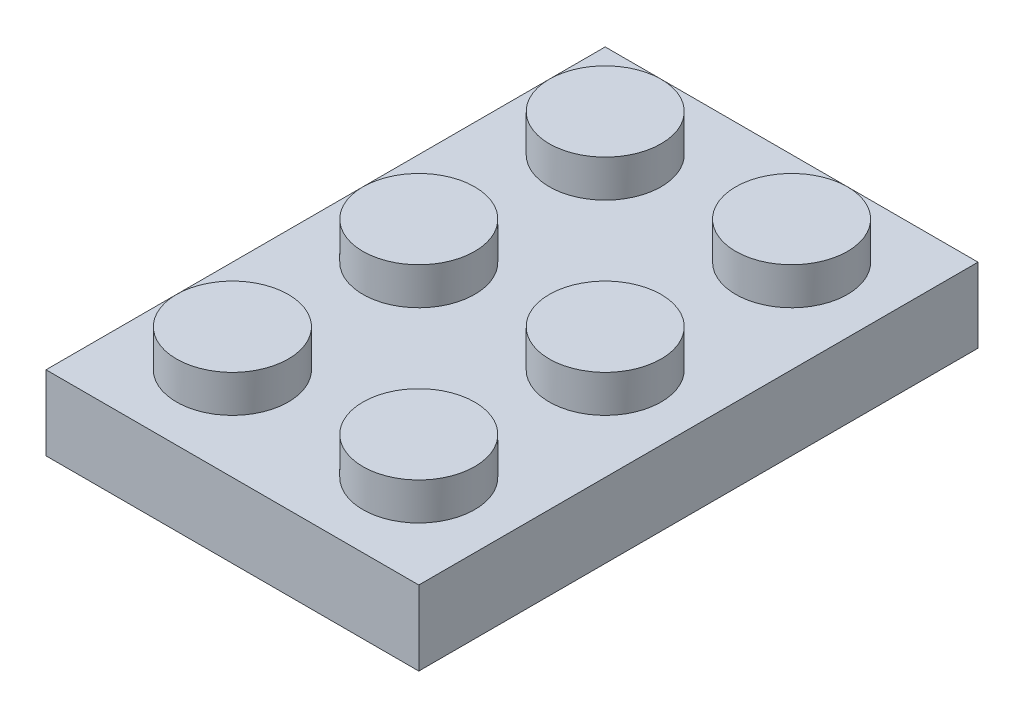
ISO-10303-21;
HEADER;
FILE_DESCRIPTION(('STEP AP214'),'2;1');
FILE_NAME('part.step','',(''),(''),'','','');
FILE_SCHEMA(('AUTOMOTIVE_DESIGN { 1 0 10303 214 1 1 1 1 }'));
ENDSEC;
DATA;
#1=APPLICATION_CONTEXT('core data for automotive mechanical design processes');
#2=APPLICATION_PROTOCOL_DEFINITION('international standard','automotive_design',2000,#1);
#3=PRODUCT_CONTEXT('',#1,'mechanical');
#4=PRODUCT('Part','Part','',(#3));
#5=PRODUCT_RELATED_PRODUCT_CATEGORY('part','',(#4));
#6=PRODUCT_DEFINITION_FORMATION('','',#4);
#7=PRODUCT_DEFINITION_CONTEXT('part definition',#1,'design');
#8=PRODUCT_DEFINITION('design','',#6,#7);
#9=PRODUCT_DEFINITION_SHAPE('','',#8);
#10=(LENGTH_UNIT() NAMED_UNIT(*) SI_UNIT(.MILLI.,.METRE.));
#11=(NAMED_UNIT(*) PLANE_ANGLE_UNIT() SI_UNIT($,.RADIAN.));
#12=(NAMED_UNIT(*) SI_UNIT($,.STERADIAN.) SOLID_ANGLE_UNIT());
#13=UNCERTAINTY_MEASURE_WITH_UNIT(LENGTH_MEASURE(1.E-05),#10,'distance_accuracy_value','');
#14=(GEOMETRIC_REPRESENTATION_CONTEXT(3) GLOBAL_UNCERTAINTY_ASSIGNED_CONTEXT((#13)) GLOBAL_UNIT_ASSIGNED_CONTEXT((#10,
#11,#12)) REPRESENTATION_CONTEXT('',''));
#15=CARTESIAN_POINT('',(0.,0.,0.));
#16=DIRECTION('',(0.,0.,1.));
#17=DIRECTION('',(1.,0.,0.));
#18=AXIS2_PLACEMENT_3D('',#15,#16,#17);
#19=CARTESIAN_POINT('',(0.,0.,0.));
#20=DIRECTION('',(0.,-1.,0.));
#21=DIRECTION('',(0.,0.,-1.));
#22=AXIS2_PLACEMENT_3D('',#19,#20,#21);
#23=PLANE('',#22);
#24=DIRECTION('',(0.,0.,1.));
#25=VECTOR('',#24,1.);
#26=CARTESIAN_POINT('',(0.,0.,0.));
#27=LINE('',#26,#25);
#28=CARTESIAN_POINT('',(0.,0.,-24.));
#29=VERTEX_POINT('',#28);
#30=CARTESIAN_POINT('',(0.,0.,0.));
#31=VERTEX_POINT('',#30);
#32=EDGE_CURVE('E184',#29,#31,#27,.T.);
#33=ORIENTED_EDGE('',*,*,#32,.F.);
#34=DIRECTION('',(-1.,0.,0.));
#35=VECTOR('',#34,1.);
#36=CARTESIAN_POINT('',(0.,0.,-24.));
#37=LINE('',#36,#35);
#38=CARTESIAN_POINT('',(16.,0.,-24.));
#39=VERTEX_POINT('',#38);
#40=EDGE_CURVE('E82',#39,#29,#37,.T.);
#41=ORIENTED_EDGE('',*,*,#40,.F.);
#42=DIRECTION('',(0.,0.,-1.));
#43=VECTOR('',#42,1.);
#44=CARTESIAN_POINT('',(16.,0.,0.));
#45=LINE('',#44,#43);
#46=CARTESIAN_POINT('',(16.,0.,0.));
#47=VERTEX_POINT('',#46);
#48=EDGE_CURVE('E196',#47,#39,#45,.T.);
#49=ORIENTED_EDGE('',*,*,#48,.F.);
#50=DIRECTION('',(1.,0.,0.));
#51=VECTOR('',#50,1.);
#52=CARTESIAN_POINT('',(0.,0.,0.));
#53=LINE('',#52,#51);
#54=EDGE_CURVE('E194',#31,#47,#53,.T.);
#55=ORIENTED_EDGE('',*,*,#54,.F.);
#56=EDGE_LOOP('',(#33,#41,#49,#55));
#57=FACE_BOUND('',#56,.T.);
#58=DIRECTION('',(-1.,0.,0.));
#59=VECTOR('',#58,1.);
#60=CARTESIAN_POINT('',(0.,0.,-22.4));
#61=LINE('',#60,#59);
#62=CARTESIAN_POINT('',(14.4,0.,-22.4));
#63=VERTEX_POINT('',#62);
#64=CARTESIAN_POINT('',(1.6,0.,-22.4));
#65=VERTEX_POINT('',#64);
#66=EDGE_CURVE('E172',#63,#65,#61,.T.);
#67=ORIENTED_EDGE('',*,*,#66,.T.);
#68=DIRECTION('',(0.,0.,1.));
#69=VECTOR('',#68,1.);
#70=CARTESIAN_POINT('',(1.6,0.,0.));
#71=LINE('',#70,#69);
#72=CARTESIAN_POINT('',(1.6,0.,-1.6));
#73=VERTEX_POINT('',#72);
#74=EDGE_CURVE('E165',#65,#73,#71,.T.);
#75=ORIENTED_EDGE('',*,*,#74,.T.);
#76=DIRECTION('',(1.,0.,0.));
#77=VECTOR('',#76,1.);
#78=CARTESIAN_POINT('',(0.,0.,-1.6));
#79=LINE('',#78,#77);
#80=CARTESIAN_POINT('',(14.4,0.,-1.6));
#81=VERTEX_POINT('',#80);
#82=EDGE_CURVE('E171',#73,#81,#79,.T.);
#83=ORIENTED_EDGE('',*,*,#82,.T.);
#84=DIRECTION('',(0.,0.,-1.));
#85=VECTOR('',#84,1.);
#86=CARTESIAN_POINT('',(14.4,0.,0.));
#87=LINE('',#86,#85);
#88=EDGE_CURVE('E52',#81,#63,#87,.T.);
#89=ORIENTED_EDGE('',*,*,#88,.T.);
#90=EDGE_LOOP('',(#67,#75,#83,#89));
#91=FACE_BOUND('',#90,.T.);
#92=ADVANCED_FACE('F37',(#57,#91),#23,.T.);
#93=CARTESIAN_POINT('',(4.,4.8,-20.));
#94=DIRECTION('',(0.,1.,0.));
#95=DIRECTION('',(0.,0.,1.));
#96=AXIS2_PLACEMENT_3D('',#93,#94,#95);
#97=PLANE('',#96);
#98=CARTESIAN_POINT('',(4.,4.8,-20.));
#99=DIRECTION('',(0.,1.,0.));
#100=DIRECTION('',(0.,0.,1.));
#101=AXIS2_PLACEMENT_3D('',#98,#99,#100);
#102=CIRCLE('',#101,2.4);
#103=CARTESIAN_POINT('',(4.,4.8,-17.6));
#104=VERTEX_POINT('',#103);
#105=EDGE_CURVE('E11',#104,#104,#102,.T.);
#106=ORIENTED_EDGE('',*,*,#105,.T.);
#107=EDGE_LOOP('',(#106));
#108=FACE_BOUND('',#107,.T.);
#109=ADVANCED_FACE('F39',(#108),#97,.T.);
#110=CARTESIAN_POINT('',(4.,4.8,-20.));
#111=DIRECTION('',(0.,-1.,0.));
#112=DIRECTION('',(0.,0.,-1.));
#113=AXIS2_PLACEMENT_3D('',#110,#111,#112);
#114=CYLINDRICAL_SURFACE('',#113,2.4);
#115=ORIENTED_EDGE('',*,*,#105,.F.);
#116=EDGE_LOOP('',(#115));
#117=FACE_BOUND('',#116,.T.);
#118=CARTESIAN_POINT('',(4.,3.2,-20.));
#119=DIRECTION('',(0.,-1.,0.));
#120=DIRECTION('',(0.,0.,-1.));
#121=AXIS2_PLACEMENT_3D('',#118,#119,#120);
#122=CIRCLE('',#121,2.4);
#123=CARTESIAN_POINT('',(4.,3.2,-22.4));
#124=VERTEX_POINT('',#123);
#125=EDGE_CURVE('E45',#124,#124,#122,.F.);
#126=ORIENTED_EDGE('',*,*,#125,.T.);
#127=EDGE_LOOP('',(#126));
#128=FACE_BOUND('',#127,.T.);
#129=ADVANCED_FACE('F233',(#117,#128),#114,.T.);
#130=CARTESIAN_POINT('',(12.,4.8,-20.));
#131=DIRECTION('',(0.,1.,0.));
#132=DIRECTION('',(0.,0.,1.));
#133=AXIS2_PLACEMENT_3D('',#130,#131,#132);
#134=PLANE('',#133);
#135=CARTESIAN_POINT('',(12.,4.8,-20.));
#136=DIRECTION('',(0.,1.,0.));
#137=DIRECTION('',(0.,0.,1.));
#138=AXIS2_PLACEMENT_3D('',#135,#136,#137);
#139=CIRCLE('',#138,2.4);
#140=CARTESIAN_POINT('',(12.,4.8,-17.6));
#141=VERTEX_POINT('',#140);
#142=EDGE_CURVE('E228',#141,#141,#139,.T.);
#143=ORIENTED_EDGE('',*,*,#142,.T.);
#144=EDGE_LOOP('',(#143));
#145=FACE_BOUND('',#144,.T.);
#146=ADVANCED_FACE('F291',(#145),#134,.T.);
#147=CARTESIAN_POINT('',(12.,4.8,-20.));
#148=DIRECTION('',(0.,-1.,0.));
#149=DIRECTION('',(0.,0.,-1.));
#150=AXIS2_PLACEMENT_3D('',#147,#148,#149);
#151=CYLINDRICAL_SURFACE('',#150,2.4);
#152=ORIENTED_EDGE('',*,*,#142,.F.);
#153=EDGE_LOOP('',(#152));
#154=FACE_BOUND('',#153,.T.);
#155=CARTESIAN_POINT('',(12.,3.2,-20.));
#156=DIRECTION('',(0.,-1.,0.));
#157=DIRECTION('',(0.,0.,-1.));
#158=AXIS2_PLACEMENT_3D('',#155,#156,#157);
#159=CIRCLE('',#158,2.4);
#160=CARTESIAN_POINT('',(12.,3.2,-22.4));
#161=VERTEX_POINT('',#160);
#162=EDGE_CURVE('E225',#161,#161,#159,.F.);
#163=ORIENTED_EDGE('',*,*,#162,.T.);
#164=EDGE_LOOP('',(#163));
#165=FACE_BOUND('',#164,.T.);
#166=ADVANCED_FACE('F287',(#154,#165),#151,.T.);
#167=CARTESIAN_POINT('',(4.,4.8,-12.));
#168=DIRECTION('',(0.,1.,0.));
#169=DIRECTION('',(0.,0.,1.));
#170=AXIS2_PLACEMENT_3D('',#167,#168,#169);
#171=PLANE('',#170);
#172=CARTESIAN_POINT('',(4.,4.8,-12.));
#173=DIRECTION('',(0.,1.,0.));
#174=DIRECTION('',(0.,0.,1.));
#175=AXIS2_PLACEMENT_3D('',#172,#173,#174);
#176=CIRCLE('',#175,2.4);
#177=CARTESIAN_POINT('',(4.,4.8,-9.6));
#178=VERTEX_POINT('',#177);
#179=EDGE_CURVE('E222',#178,#178,#176,.T.);
#180=ORIENTED_EDGE('',*,*,#179,.T.);
#181=EDGE_LOOP('',(#180));
#182=FACE_BOUND('',#181,.T.);
#183=ADVANCED_FACE('F283',(#182),#171,.T.);
#184=CARTESIAN_POINT('',(4.,4.8,-12.));
#185=DIRECTION('',(0.,-1.,0.));
#186=DIRECTION('',(0.,0.,-1.));
#187=AXIS2_PLACEMENT_3D('',#184,#185,#186);
#188=CYLINDRICAL_SURFACE('',#187,2.4);
#189=ORIENTED_EDGE('',*,*,#179,.F.);
#190=EDGE_LOOP('',(#189));
#191=FACE_BOUND('',#190,.T.);
#192=CARTESIAN_POINT('',(4.,3.2,-12.));
#193=DIRECTION('',(0.,-1.,0.));
#194=DIRECTION('',(0.,0.,-1.));
#195=AXIS2_PLACEMENT_3D('',#192,#193,#194);
#196=CIRCLE('',#195,2.4);
#197=CARTESIAN_POINT('',(4.,3.2,-14.4));
#198=VERTEX_POINT('',#197);
#199=EDGE_CURVE('E219',#198,#198,#196,.F.);
#200=ORIENTED_EDGE('',*,*,#199,.T.);
#201=EDGE_LOOP('',(#200));
#202=FACE_BOUND('',#201,.T.);
#203=ADVANCED_FACE('F279',(#191,#202),#188,.T.);
#204=CARTESIAN_POINT('',(12.,4.8,-12.));
#205=DIRECTION('',(0.,1.,0.));
#206=DIRECTION('',(0.,0.,1.));
#207=AXIS2_PLACEMENT_3D('',#204,#205,#206);
#208=PLANE('',#207);
#209=CARTESIAN_POINT('',(12.,4.8,-12.));
#210=DIRECTION('',(0.,1.,0.));
#211=DIRECTION('',(0.,0.,1.));
#212=AXIS2_PLACEMENT_3D('',#209,#210,#211);
#213=CIRCLE('',#212,2.4);
#214=CARTESIAN_POINT('',(12.,4.8,-9.6));
#215=VERTEX_POINT('',#214);
#216=EDGE_CURVE('E216',#215,#215,#213,.T.);
#217=ORIENTED_EDGE('',*,*,#216,.T.);
#218=EDGE_LOOP('',(#217));
#219=FACE_BOUND('',#218,.T.);
#220=ADVANCED_FACE('F275',(#219),#208,.T.);
#221=CARTESIAN_POINT('',(12.,4.8,-12.));
#222=DIRECTION('',(0.,-1.,0.));
#223=DIRECTION('',(0.,0.,-1.));
#224=AXIS2_PLACEMENT_3D('',#221,#222,#223);
#225=CYLINDRICAL_SURFACE('',#224,2.4);
#226=ORIENTED_EDGE('',*,*,#216,.F.);
#227=EDGE_LOOP('',(#226));
#228=FACE_BOUND('',#227,.T.);
#229=CARTESIAN_POINT('',(12.,3.2,-12.));
#230=DIRECTION('',(0.,-1.,0.));
#231=DIRECTION('',(0.,0.,-1.));
#232=AXIS2_PLACEMENT_3D('',#229,#230,#231);
#233=CIRCLE('',#232,2.4);
#234=CARTESIAN_POINT('',(12.,3.2,-14.4));
#235=VERTEX_POINT('',#234);
#236=EDGE_CURVE('E213',#235,#235,#233,.F.);
#237=ORIENTED_EDGE('',*,*,#236,.T.);
#238=EDGE_LOOP('',(#237));
#239=FACE_BOUND('',#238,.T.);
#240=ADVANCED_FACE('F271',(#228,#239),#225,.T.);
#241=CARTESIAN_POINT('',(0.,3.2,0.));
#242=DIRECTION('',(1.,0.,0.));
#243=DIRECTION('',(0.,0.,-1.));
#244=AXIS2_PLACEMENT_3D('',#241,#242,#243);
#245=PLANE('',#244);
#246=ORIENTED_EDGE('',*,*,#32,.T.);
#247=DIRECTION('',(0.,-1.,0.));
#248=VECTOR('',#247,1.);
#249=CARTESIAN_POINT('',(0.,3.2,0.));
#250=LINE('',#249,#248);
#251=CARTESIAN_POINT('',(0.,3.2,0.));
#252=VERTEX_POINT('',#251);
#253=EDGE_CURVE('E205',#252,#31,#250,.T.);
#254=ORIENTED_EDGE('',*,*,#253,.F.);
#255=DIRECTION('',(0.,0.,1.));
#256=VECTOR('',#255,1.);
#257=CARTESIAN_POINT('',(0.,3.2,0.));
#258=LINE('',#257,#256);
#259=CARTESIAN_POINT('',(0.,3.2,-24.));
#260=VERTEX_POINT('',#259);
#261=EDGE_CURVE('E185',#260,#252,#258,.T.);
#262=ORIENTED_EDGE('',*,*,#261,.F.);
#263=DIRECTION('',(0.,-1.,0.));
#264=VECTOR('',#263,1.);
#265=CARTESIAN_POINT('',(0.,3.2,-24.));
#266=LINE('',#265,#264);
#267=EDGE_CURVE('E191',#260,#29,#266,.T.);
#268=ORIENTED_EDGE('',*,*,#267,.T.);
#269=EDGE_LOOP('',(#246,#254,#262,#268));
#270=FACE_BOUND('',#269,.T.);
#271=ADVANCED_FACE('F268',(#270),#245,.F.);
#272=CARTESIAN_POINT('',(0.,3.2,0.));
#273=DIRECTION('',(0.,0.,-1.));
#274=DIRECTION('',(-1.,0.,0.));
#275=AXIS2_PLACEMENT_3D('',#272,#273,#274);
#276=PLANE('',#275);
#277=ORIENTED_EDGE('',*,*,#54,.T.);
#278=DIRECTION('',(0.,-1.,0.));
#279=VECTOR('',#278,1.);
#280=CARTESIAN_POINT('',(16.,3.2,0.));
#281=LINE('',#280,#279);
#282=CARTESIAN_POINT('',(16.,3.2,0.));
#283=VERTEX_POINT('',#282);
#284=EDGE_CURVE('E202',#283,#47,#281,.T.);
#285=ORIENTED_EDGE('',*,*,#284,.F.);
#286=DIRECTION('',(1.,0.,0.));
#287=VECTOR('',#286,1.);
#288=CARTESIAN_POINT('',(0.,3.2,0.));
#289=LINE('',#288,#287);
#290=EDGE_CURVE('E90',#252,#283,#289,.T.);
#291=ORIENTED_EDGE('',*,*,#290,.F.);
#292=ORIENTED_EDGE('',*,*,#253,.T.);
#293=EDGE_LOOP('',(#277,#285,#291,#292));
#294=FACE_BOUND('',#293,.T.);
#295=ADVANCED_FACE('F264',(#294),#276,.F.);
#296=CARTESIAN_POINT('',(16.,3.2,0.));
#297=DIRECTION('',(-1.,0.,0.));
#298=DIRECTION('',(0.,0.,1.));
#299=AXIS2_PLACEMENT_3D('',#296,#297,#298);
#300=PLANE('',#299);
#301=ORIENTED_EDGE('',*,*,#48,.T.);
#302=DIRECTION('',(0.,-1.,0.));
#303=VECTOR('',#302,1.);
#304=CARTESIAN_POINT('',(16.,3.2,-24.));
#305=LINE('',#304,#303);
#306=CARTESIAN_POINT('',(16.,3.2,-24.));
#307=VERTEX_POINT('',#306);
#308=EDGE_CURVE('E200',#307,#39,#305,.T.);
#309=ORIENTED_EDGE('',*,*,#308,.F.);
#310=DIRECTION('',(0.,0.,-1.));
#311=VECTOR('',#310,1.);
#312=CARTESIAN_POINT('',(16.,3.2,0.));
#313=LINE('',#312,#311);
#314=EDGE_CURVE('E188',#283,#307,#313,.T.);
#315=ORIENTED_EDGE('',*,*,#314,.F.);
#316=ORIENTED_EDGE('',*,*,#284,.T.);
#317=EDGE_LOOP('',(#301,#309,#315,#316));
#318=FACE_BOUND('',#317,.T.);
#319=ADVANCED_FACE('F248',(#318),#300,.F.);
#320=CARTESIAN_POINT('',(0.,3.2,-24.));
#321=DIRECTION('',(0.,0.,1.));
#322=DIRECTION('',(1.,0.,0.));
#323=AXIS2_PLACEMENT_3D('',#320,#321,#322);
#324=PLANE('',#323);
#325=ORIENTED_EDGE('',*,*,#40,.T.);
#326=ORIENTED_EDGE('',*,*,#267,.F.);
#327=DIRECTION('',(-1.,0.,0.));
#328=VECTOR('',#327,1.);
#329=CARTESIAN_POINT('',(0.,3.2,-24.));
#330=LINE('',#329,#328);
#331=EDGE_CURVE('E61',#307,#260,#330,.T.);
#332=ORIENTED_EDGE('',*,*,#331,.F.);
#333=ORIENTED_EDGE('',*,*,#308,.T.);
#334=EDGE_LOOP('',(#325,#326,#332,#333));
#335=FACE_BOUND('',#334,.T.);
#336=ADVANCED_FACE('F238',(#335),#324,.F.);
#337=CARTESIAN_POINT('',(0.,3.2,0.));
#338=DIRECTION('',(0.,-1.,0.));
#339=DIRECTION('',(0.,0.,-1.));
#340=AXIS2_PLACEMENT_3D('',#337,#338,#339);
#341=PLANE('',#340);
#342=CARTESIAN_POINT('',(4.,3.2,-4.));
#343=DIRECTION('',(0.,-1.,0.));
#344=DIRECTION('',(0.,0.,-1.));
#345=AXIS2_PLACEMENT_3D('',#342,#343,#344);
#346=CIRCLE('',#345,2.4);
#347=CARTESIAN_POINT('',(4.,3.2,-6.4));
#348=VERTEX_POINT('',#347);
#349=EDGE_CURVE('E210',#348,#348,#346,.F.);
#350=ORIENTED_EDGE('',*,*,#349,.F.);
#351=EDGE_LOOP('',(#350));
#352=FACE_BOUND('',#351,.T.);
#353=CARTESIAN_POINT('',(12.,3.2,-4.));
#354=DIRECTION('',(0.,-1.,0.));
#355=DIRECTION('',(0.,0.,-1.));
#356=AXIS2_PLACEMENT_3D('',#353,#354,#355);
#357=CIRCLE('',#356,2.4);
#358=CARTESIAN_POINT('',(12.,3.2,-6.4));
#359=VERTEX_POINT('',#358);
#360=EDGE_CURVE('E207',#359,#359,#357,.F.);
#361=ORIENTED_EDGE('',*,*,#360,.F.);
#362=EDGE_LOOP('',(#361));
#363=FACE_BOUND('',#362,.T.);
#364=ORIENTED_EDGE('',*,*,#261,.T.);
#365=ORIENTED_EDGE('',*,*,#290,.T.);
#366=ORIENTED_EDGE('',*,*,#314,.T.);
#367=ORIENTED_EDGE('',*,*,#331,.T.);
#368=EDGE_LOOP('',(#364,#365,#366,#367));
#369=FACE_BOUND('',#368,.T.);
#370=ORIENTED_EDGE('',*,*,#236,.F.);
#371=EDGE_LOOP('',(#370));
#372=FACE_BOUND('',#371,.T.);
#373=ORIENTED_EDGE('',*,*,#199,.F.);
#374=EDGE_LOOP('',(#373));
#375=FACE_BOUND('',#374,.T.);
#376=ORIENTED_EDGE('',*,*,#162,.F.);
#377=EDGE_LOOP('',(#376));
#378=FACE_BOUND('',#377,.T.);
#379=ORIENTED_EDGE('',*,*,#125,.F.);
#380=EDGE_LOOP('',(#379));
#381=FACE_BOUND('',#380,.T.);
#382=ADVANCED_FACE('F235',(#352,#363,#369,#372,#375,#378,#381),#341,.F.);
#383=CARTESIAN_POINT('',(12.,4.8,-4.));
#384=DIRECTION('',(0.,-1.,0.));
#385=DIRECTION('',(0.,0.,-1.));
#386=AXIS2_PLACEMENT_3D('',#383,#384,#385);
#387=CYLINDRICAL_SURFACE('',#386,2.4);
#388=CARTESIAN_POINT('',(12.,4.8,-4.));
#389=DIRECTION('',(0.,1.,0.));
#390=DIRECTION('',(0.,0.,1.));
#391=AXIS2_PLACEMENT_3D('',#388,#389,#390);
#392=CIRCLE('',#391,2.4);
#393=CARTESIAN_POINT('',(12.,4.8,-1.6));
#394=VERTEX_POINT('',#393);
#395=EDGE_CURVE('E180',#394,#394,#392,.T.);
#396=ORIENTED_EDGE('',*,*,#395,.F.);
#397=EDGE_LOOP('',(#396));
#398=FACE_BOUND('',#397,.T.);
#399=ORIENTED_EDGE('',*,*,#360,.T.);
#400=EDGE_LOOP('',(#399));
#401=FACE_BOUND('',#400,.T.);
#402=ADVANCED_FACE('F237',(#398,#401),#387,.T.);
#403=CARTESIAN_POINT('',(12.,4.8,-4.));
#404=DIRECTION('',(0.,1.,0.));
#405=DIRECTION('',(0.,0.,1.));
#406=AXIS2_PLACEMENT_3D('',#403,#404,#405);
#407=PLANE('',#406);
#408=ORIENTED_EDGE('',*,*,#395,.T.);
#409=EDGE_LOOP('',(#408));
#410=FACE_BOUND('',#409,.T.);
#411=ADVANCED_FACE('F245',(#410),#407,.T.);
#412=CARTESIAN_POINT('',(4.,4.8,-4.));
#413=DIRECTION('',(0.,-1.,0.));
#414=DIRECTION('',(0.,0.,-1.));
#415=AXIS2_PLACEMENT_3D('',#412,#413,#414);
#416=CYLINDRICAL_SURFACE('',#415,2.4);
#417=CARTESIAN_POINT('',(4.,4.8,-4.));
#418=DIRECTION('',(0.,1.,0.));
#419=DIRECTION('',(0.,0.,1.));
#420=AXIS2_PLACEMENT_3D('',#417,#418,#419);
#421=CIRCLE('',#420,2.4);
#422=CARTESIAN_POINT('',(4.,4.8,-1.6));
#423=VERTEX_POINT('',#422);
#424=EDGE_CURVE('E177',#423,#423,#421,.T.);
#425=ORIENTED_EDGE('',*,*,#424,.F.);
#426=EDGE_LOOP('',(#425));
#427=FACE_BOUND('',#426,.T.);
#428=ORIENTED_EDGE('',*,*,#349,.T.);
#429=EDGE_LOOP('',(#428));
#430=FACE_BOUND('',#429,.T.);
#431=ADVANCED_FACE('F357',(#427,#430),#416,.T.);
#432=CARTESIAN_POINT('',(4.,4.8,-4.));
#433=DIRECTION('',(0.,1.,0.));
#434=DIRECTION('',(0.,0.,1.));
#435=AXIS2_PLACEMENT_3D('',#432,#433,#434);
#436=PLANE('',#435);
#437=ORIENTED_EDGE('',*,*,#424,.T.);
#438=EDGE_LOOP('',(#437));
#439=FACE_BOUND('',#438,.T.);
#440=ADVANCED_FACE('F387',(#439),#436,.T.);
#441=CARTESIAN_POINT('',(4.,3.2,-20.));
#442=DIRECTION('',(0.,1.,0.));
#443=DIRECTION('',(0.,0.,1.));
#444=AXIS2_PLACEMENT_3D('',#441,#442,#443);
#445=PLANE('',#444);
#446=CARTESIAN_POINT('',(4.,3.2,-20.));
#447=DIRECTION('',(0.,1.,0.));
#448=DIRECTION('',(0.,0.,1.));
#449=AXIS2_PLACEMENT_3D('',#446,#447,#448);
#450=CIRCLE('',#449,0.799999999999999);
#451=CARTESIAN_POINT('',(4.,3.2,-19.2));
#452=VERTEX_POINT('',#451);
#453=EDGE_CURVE('E181',#452,#452,#450,.T.);
#454=ORIENTED_EDGE('',*,*,#453,.F.);
#455=EDGE_LOOP('',(#454));
#456=FACE_BOUND('',#455,.T.);
#457=ADVANCED_FACE('F396',(#456),#445,.F.);
#458=CARTESIAN_POINT('',(4.,4.8,-20.));
#459=DIRECTION('',(0.,-1.,0.));
#460=DIRECTION('',(0.,0.,-1.));
#461=AXIS2_PLACEMENT_3D('',#458,#459,#460);
#462=CYLINDRICAL_SURFACE('',#461,0.799999999999999);
#463=ORIENTED_EDGE('',*,*,#453,.T.);
#464=EDGE_LOOP('',(#463));
#465=FACE_BOUND('',#464,.T.);
#466=CARTESIAN_POINT('',(4.,1.6,-20.));
#467=DIRECTION('',(0.,-1.,0.));
#468=DIRECTION('',(0.,0.,-1.));
#469=AXIS2_PLACEMENT_3D('',#466,#467,#468);
#470=CIRCLE('',#469,0.799999999999999);
#471=CARTESIAN_POINT('',(4.,1.6,-20.8));
#472=VERTEX_POINT('',#471);
#473=EDGE_CURVE('E153',#472,#472,#470,.F.);
#474=ORIENTED_EDGE('',*,*,#473,.F.);
#475=EDGE_LOOP('',(#474));
#476=FACE_BOUND('',#475,.T.);
#477=ADVANCED_FACE('F409',(#465,#476),#462,.F.);
#478=CARTESIAN_POINT('',(12.,3.2,-20.));
#479=DIRECTION('',(0.,1.,0.));
#480=DIRECTION('',(0.,0.,1.));
#481=AXIS2_PLACEMENT_3D('',#478,#479,#480);
#482=PLANE('',#481);
#483=CARTESIAN_POINT('',(12.,3.2,-20.));
#484=DIRECTION('',(0.,1.,0.));
#485=DIRECTION('',(0.,0.,1.));
#486=AXIS2_PLACEMENT_3D('',#483,#484,#485);
#487=CIRCLE('',#486,0.799999999999999);
#488=CARTESIAN_POINT('',(12.,3.2,-19.2));
#489=VERTEX_POINT('',#488);
#490=EDGE_CURVE('E150',#489,#489,#487,.T.);
#491=ORIENTED_EDGE('',*,*,#490,.F.);
#492=EDGE_LOOP('',(#491));
#493=FACE_BOUND('',#492,.T.);
#494=ADVANCED_FACE('F418',(#493),#482,.F.);
#495=CARTESIAN_POINT('',(12.,4.8,-20.));
#496=DIRECTION('',(0.,-1.,0.));
#497=DIRECTION('',(0.,0.,-1.));
#498=AXIS2_PLACEMENT_3D('',#495,#496,#497);
#499=CYLINDRICAL_SURFACE('',#498,0.799999999999999);
#500=ORIENTED_EDGE('',*,*,#490,.T.);
#501=EDGE_LOOP('',(#500));
#502=FACE_BOUND('',#501,.T.);
#503=CARTESIAN_POINT('',(12.,1.6,-20.));
#504=DIRECTION('',(0.,-1.,0.));
#505=DIRECTION('',(0.,0.,-1.));
#506=AXIS2_PLACEMENT_3D('',#503,#504,#505);
#507=CIRCLE('',#506,0.799999999999999);
#508=CARTESIAN_POINT('',(12.,1.6,-20.8));
#509=VERTEX_POINT('',#508);
#510=EDGE_CURVE('E147',#509,#509,#507,.F.);
#511=ORIENTED_EDGE('',*,*,#510,.F.);
#512=EDGE_LOOP('',(#511));
#513=FACE_BOUND('',#512,.T.);
#514=ADVANCED_FACE('F427',(#502,#513),#499,.F.);
#515=CARTESIAN_POINT('',(4.,3.2,-12.));
#516=DIRECTION('',(0.,1.,0.));
#517=DIRECTION('',(0.,0.,1.));
#518=AXIS2_PLACEMENT_3D('',#515,#516,#517);
#519=PLANE('',#518);
#520=CARTESIAN_POINT('',(4.,3.2,-12.));
#521=DIRECTION('',(0.,1.,0.));
#522=DIRECTION('',(0.,0.,1.));
#523=AXIS2_PLACEMENT_3D('',#520,#521,#522);
#524=CIRCLE('',#523,0.799999999999999);
#525=CARTESIAN_POINT('',(4.,3.2,-11.2));
#526=VERTEX_POINT('',#525);
#527=EDGE_CURVE('E146',#526,#526,#524,.T.);
#528=ORIENTED_EDGE('',*,*,#527,.F.);
#529=EDGE_LOOP('',(#528));
#530=FACE_BOUND('',#529,.T.);
#531=ADVANCED_FACE('F436',(#530),#519,.F.);
#532=CARTESIAN_POINT('',(4.,4.8,-12.));
#533=DIRECTION('',(0.,-1.,0.));
#534=DIRECTION('',(0.,0.,-1.));
#535=AXIS2_PLACEMENT_3D('',#532,#533,#534);
#536=CYLINDRICAL_SURFACE('',#535,0.799999999999999);
#537=ORIENTED_EDGE('',*,*,#527,.T.);
#538=EDGE_LOOP('',(#537));
#539=FACE_BOUND('',#538,.T.);
#540=CARTESIAN_POINT('',(4.,1.6,-12.));
#541=DIRECTION('',(0.,-1.,0.));
#542=DIRECTION('',(0.,0.,-1.));
#543=AXIS2_PLACEMENT_3D('',#540,#541,#542);
#544=CIRCLE('',#543,0.799999999999999);
#545=CARTESIAN_POINT('',(4.,1.6,-12.8));
#546=VERTEX_POINT('',#545);
#547=EDGE_CURVE('E143',#546,#546,#544,.F.);
#548=ORIENTED_EDGE('',*,*,#547,.F.);
#549=EDGE_LOOP('',(#548));
#550=FACE_BOUND('',#549,.T.);
#551=ADVANCED_FACE('F445',(#539,#550),#536,.F.);
#552=CARTESIAN_POINT('',(12.,3.2,-12.));
#553=DIRECTION('',(0.,1.,0.));
#554=DIRECTION('',(0.,0.,1.));
#555=AXIS2_PLACEMENT_3D('',#552,#553,#554);
#556=PLANE('',#555);
#557=CARTESIAN_POINT('',(12.,3.2,-12.));
#558=DIRECTION('',(0.,1.,0.));
#559=DIRECTION('',(0.,0.,1.));
#560=AXIS2_PLACEMENT_3D('',#557,#558,#559);
#561=CIRCLE('',#560,0.799999999999999);
#562=CARTESIAN_POINT('',(12.,3.2,-11.2));
#563=VERTEX_POINT('',#562);
#564=EDGE_CURVE('E141',#563,#563,#561,.T.);
#565=ORIENTED_EDGE('',*,*,#564,.F.);
#566=EDGE_LOOP('',(#565));
#567=FACE_BOUND('',#566,.T.);
#568=ADVANCED_FACE('F454',(#567),#556,.F.);
#569=CARTESIAN_POINT('',(12.,4.8,-12.));
#570=DIRECTION('',(0.,-1.,0.));
#571=DIRECTION('',(0.,0.,-1.));
#572=AXIS2_PLACEMENT_3D('',#569,#570,#571);
#573=CYLINDRICAL_SURFACE('',#572,0.799999999999999);
#574=ORIENTED_EDGE('',*,*,#564,.T.);
#575=EDGE_LOOP('',(#574));
#576=FACE_BOUND('',#575,.T.);
#577=CARTESIAN_POINT('',(12.,1.6,-12.));
#578=DIRECTION('',(0.,-1.,0.));
#579=DIRECTION('',(0.,0.,-1.));
#580=AXIS2_PLACEMENT_3D('',#577,#578,#579);
#581=CIRCLE('',#580,0.799999999999999);
#582=CARTESIAN_POINT('',(12.,1.6,-12.8));
#583=VERTEX_POINT('',#582);
#584=EDGE_CURVE('E138',#583,#583,#581,.F.);
#585=ORIENTED_EDGE('',*,*,#584,.F.);
#586=EDGE_LOOP('',(#585));
#587=FACE_BOUND('',#586,.T.);
#588=ADVANCED_FACE('F463',(#576,#587),#573,.F.);
#589=CARTESIAN_POINT('',(1.6,3.2,0.));
#590=DIRECTION('',(1.,0.,0.));
#591=DIRECTION('',(0.,0.,-1.));
#592=AXIS2_PLACEMENT_3D('',#589,#590,#591);
#593=PLANE('',#592);
#594=ORIENTED_EDGE('',*,*,#74,.F.);
#595=DIRECTION('',(0.,-1.,0.));
#596=VECTOR('',#595,1.);
#597=CARTESIAN_POINT('',(1.6,3.2,-22.4));
#598=LINE('',#597,#596);
#599=CARTESIAN_POINT('',(1.6,1.6,-22.4));
#600=VERTEX_POINT('',#599);
#601=EDGE_CURVE('E134',#600,#65,#598,.T.);
#602=ORIENTED_EDGE('',*,*,#601,.F.);
#603=DIRECTION('',(0.,0.,1.));
#604=VECTOR('',#603,1.);
#605=CARTESIAN_POINT('',(1.6,1.6,0.));
#606=LINE('',#605,#604);
#607=CARTESIAN_POINT('',(1.6,1.6,-1.6));
#608=VERTEX_POINT('',#607);
#609=EDGE_CURVE('E123',#600,#608,#606,.T.);
#610=ORIENTED_EDGE('',*,*,#609,.T.);
#611=DIRECTION('',(0.,-1.,0.));
#612=VECTOR('',#611,1.);
#613=CARTESIAN_POINT('',(1.6,3.2,-1.6));
#614=LINE('',#613,#612);
#615=EDGE_CURVE('E117',#608,#73,#614,.T.);
#616=ORIENTED_EDGE('',*,*,#615,.T.);
#617=EDGE_LOOP('',(#594,#602,#610,#616));
#618=FACE_BOUND('',#617,.T.);
#619=ADVANCED_FACE('F472',(#618),#593,.T.);
#620=CARTESIAN_POINT('',(0.,3.2,-1.6));
#621=DIRECTION('',(0.,0.,-1.));
#622=DIRECTION('',(-1.,0.,0.));
#623=AXIS2_PLACEMENT_3D('',#620,#621,#622);
#624=PLANE('',#623);
#625=ORIENTED_EDGE('',*,*,#82,.F.);
#626=ORIENTED_EDGE('',*,*,#615,.F.);
#627=DIRECTION('',(1.,0.,0.));
#628=VECTOR('',#627,1.);
#629=CARTESIAN_POINT('',(0.,1.6,-1.6));
#630=LINE('',#629,#628);
#631=CARTESIAN_POINT('',(14.4,1.6,-1.6));
#632=VERTEX_POINT('',#631);
#633=EDGE_CURVE('E112',#608,#632,#630,.T.);
#634=ORIENTED_EDGE('',*,*,#633,.T.);
#635=DIRECTION('',(0.,-1.,0.));
#636=VECTOR('',#635,1.);
#637=CARTESIAN_POINT('',(14.4,3.2,-1.6));
#638=LINE('',#637,#636);
#639=EDGE_CURVE('E114',#632,#81,#638,.T.);
#640=ORIENTED_EDGE('',*,*,#639,.T.);
#641=EDGE_LOOP('',(#625,#626,#634,#640));
#642=FACE_BOUND('',#641,.T.);
#643=ADVANCED_FACE('F113',(#642),#624,.T.);
#644=CARTESIAN_POINT('',(14.4,3.2,0.));
#645=DIRECTION('',(-1.,0.,0.));
#646=DIRECTION('',(0.,0.,1.));
#647=AXIS2_PLACEMENT_3D('',#644,#645,#646);
#648=PLANE('',#647);
#649=ORIENTED_EDGE('',*,*,#88,.F.);
#650=ORIENTED_EDGE('',*,*,#639,.F.);
#651=DIRECTION('',(0.,0.,-1.));
#652=VECTOR('',#651,1.);
#653=CARTESIAN_POINT('',(14.4,1.6,0.));
#654=LINE('',#653,#652);
#655=CARTESIAN_POINT('',(14.4,1.6,-22.4));
#656=VERTEX_POINT('',#655);
#657=EDGE_CURVE('E122',#632,#656,#654,.T.);
#658=ORIENTED_EDGE('',*,*,#657,.T.);
#659=DIRECTION('',(0.,-1.,0.));
#660=VECTOR('',#659,1.);
#661=CARTESIAN_POINT('',(14.4,3.2,-22.4));
#662=LINE('',#661,#660);
#663=EDGE_CURVE('E127',#656,#63,#662,.T.);
#664=ORIENTED_EDGE('',*,*,#663,.T.);
#665=EDGE_LOOP('',(#649,#650,#658,#664));
#666=FACE_BOUND('',#665,.T.);
#667=ADVANCED_FACE('F125',(#666),#648,.T.);
#668=CARTESIAN_POINT('',(0.,3.2,-22.4));
#669=DIRECTION('',(0.,0.,1.));
#670=DIRECTION('',(1.,0.,0.));
#671=AXIS2_PLACEMENT_3D('',#668,#669,#670);
#672=PLANE('',#671);
#673=ORIENTED_EDGE('',*,*,#66,.F.);
#674=ORIENTED_EDGE('',*,*,#663,.F.);
#675=DIRECTION('',(-1.,0.,0.));
#676=VECTOR('',#675,1.);
#677=CARTESIAN_POINT('',(0.,1.6,-22.4));
#678=LINE('',#677,#676);
#679=EDGE_CURVE('E132',#656,#600,#678,.T.);
#680=ORIENTED_EDGE('',*,*,#679,.T.);
#681=ORIENTED_EDGE('',*,*,#601,.T.);
#682=EDGE_LOOP('',(#673,#674,#680,#681));
#683=FACE_BOUND('',#682,.T.);
#684=ADVANCED_FACE('F496',(#683),#672,.T.);
#685=CARTESIAN_POINT('',(0.,1.6,0.));
#686=DIRECTION('',(0.,-1.,0.));
#687=DIRECTION('',(0.,0.,-1.));
#688=AXIS2_PLACEMENT_3D('',#685,#686,#687);
#689=PLANE('',#688);
#690=CARTESIAN_POINT('',(4.,1.6,-4.));
#691=DIRECTION('',(0.,-1.,0.));
#692=DIRECTION('',(0.,0.,-1.));
#693=AXIS2_PLACEMENT_3D('',#690,#691,#692);
#694=CIRCLE('',#693,0.799999999999999);
#695=CARTESIAN_POINT('',(4.,1.6,-4.8));
#696=VERTEX_POINT('',#695);
#697=EDGE_CURVE('E142',#696,#696,#694,.F.);
#698=ORIENTED_EDGE('',*,*,#697,.T.);
#699=EDGE_LOOP('',(#698));
#700=FACE_BOUND('',#699,.T.);
#701=CARTESIAN_POINT('',(12.,1.6,-4.));
#702=DIRECTION('',(0.,-1.,0.));
#703=DIRECTION('',(0.,0.,-1.));
#704=AXIS2_PLACEMENT_3D('',#701,#702,#703);
#705=CIRCLE('',#704,0.799999999999999);
#706=CARTESIAN_POINT('',(12.,1.6,-4.8));
#707=VERTEX_POINT('',#706);
#708=EDGE_CURVE('E159',#707,#707,#705,.F.);
#709=ORIENTED_EDGE('',*,*,#708,.T.);
#710=EDGE_LOOP('',(#709));
#711=FACE_BOUND('',#710,.T.);
#712=ORIENTED_EDGE('',*,*,#609,.F.);
#713=ORIENTED_EDGE('',*,*,#679,.F.);
#714=ORIENTED_EDGE('',*,*,#657,.F.);
#715=ORIENTED_EDGE('',*,*,#633,.F.);
#716=EDGE_LOOP('',(#712,#713,#714,#715));
#717=FACE_BOUND('',#716,.T.);
#718=ORIENTED_EDGE('',*,*,#584,.T.);
#719=EDGE_LOOP('',(#718));
#720=FACE_BOUND('',#719,.T.);
#721=ORIENTED_EDGE('',*,*,#547,.T.);
#722=EDGE_LOOP('',(#721));
#723=FACE_BOUND('',#722,.T.);
#724=ORIENTED_EDGE('',*,*,#510,.T.);
#725=EDGE_LOOP('',(#724));
#726=FACE_BOUND('',#725,.T.);
#727=ORIENTED_EDGE('',*,*,#473,.T.);
#728=EDGE_LOOP('',(#727));
#729=FACE_BOUND('',#728,.T.);
#730=ADVANCED_FACE('F130',(#700,#711,#717,#720,#723,#726,#729),#689,.T.);
#731=CARTESIAN_POINT('',(12.,4.8,-4.));
#732=DIRECTION('',(0.,-1.,0.));
#733=DIRECTION('',(0.,0.,-1.));
#734=AXIS2_PLACEMENT_3D('',#731,#732,#733);
#735=CYLINDRICAL_SURFACE('',#734,0.799999999999999);
#736=CARTESIAN_POINT('',(12.,3.2,-4.));
#737=DIRECTION('',(0.,1.,0.));
#738=DIRECTION('',(0.,0.,1.));
#739=AXIS2_PLACEMENT_3D('',#736,#737,#738);
#740=CIRCLE('',#739,0.799999999999999);
#741=CARTESIAN_POINT('',(12.,3.2,-3.2));
#742=VERTEX_POINT('',#741);
#743=EDGE_CURVE('E162',#742,#742,#740,.T.);
#744=ORIENTED_EDGE('',*,*,#743,.T.);
#745=EDGE_LOOP('',(#744));
#746=FACE_BOUND('',#745,.T.);
#747=ORIENTED_EDGE('',*,*,#708,.F.);
#748=EDGE_LOOP('',(#747));
#749=FACE_BOUND('',#748,.T.);
#750=ADVANCED_FACE('F512',(#746,#749),#735,.F.);
#751=CARTESIAN_POINT('',(12.,3.2,-4.));
#752=DIRECTION('',(0.,1.,0.));
#753=DIRECTION('',(0.,0.,1.));
#754=AXIS2_PLACEMENT_3D('',#751,#752,#753);
#755=PLANE('',#754);
#756=ORIENTED_EDGE('',*,*,#743,.F.);
#757=EDGE_LOOP('',(#756));
#758=FACE_BOUND('',#757,.T.);
#759=ADVANCED_FACE('F521',(#758),#755,.F.);
#760=CARTESIAN_POINT('',(4.,4.8,-4.));
#761=DIRECTION('',(0.,-1.,0.));
#762=DIRECTION('',(0.,0.,-1.));
#763=AXIS2_PLACEMENT_3D('',#760,#761,#762);
#764=CYLINDRICAL_SURFACE('',#763,0.799999999999999);
#765=CARTESIAN_POINT('',(4.,3.2,-4.));
#766=DIRECTION('',(0.,1.,0.));
#767=DIRECTION('',(0.,0.,1.));
#768=AXIS2_PLACEMENT_3D('',#765,#766,#767);
#769=CIRCLE('',#768,0.799999999999999);
#770=CARTESIAN_POINT('',(4.,3.2,-3.2));
#771=VERTEX_POINT('',#770);
#772=EDGE_CURVE('E166',#771,#771,#769,.T.);
#773=ORIENTED_EDGE('',*,*,#772,.T.);
#774=EDGE_LOOP('',(#773));
#775=FACE_BOUND('',#774,.T.);
#776=ORIENTED_EDGE('',*,*,#697,.F.);
#777=EDGE_LOOP('',(#776));
#778=FACE_BOUND('',#777,.T.);
#779=ADVANCED_FACE('F530',(#775,#778),#764,.F.);
#780=CARTESIAN_POINT('',(4.,3.2,-4.));
#781=DIRECTION('',(0.,1.,0.));
#782=DIRECTION('',(0.,0.,1.));
#783=AXIS2_PLACEMENT_3D('',#780,#781,#782);
#784=PLANE('',#783);
#785=ORIENTED_EDGE('',*,*,#772,.F.);
#786=EDGE_LOOP('',(#785));
#787=FACE_BOUND('',#786,.T.);
#788=ADVANCED_FACE('F539',(#787),#784,.F.);
#789=CLOSED_SHELL('',(#92,#109,#129,#146,#166,#183,#203,#220,#240,#271,#295,#319,#336,#382,#402,
#411,#431,#440,#457,#477,#494,#514,#531,#551,#568,#588,#619,#643,#667,#684,#730,#750,#759,#779,#788));
#790=MANIFOLD_SOLID_BREP('B2',#789);
#791=ADVANCED_BREP_SHAPE_REPRESENTATION('',(#18,#790),#14);
#792=SHAPE_DEFINITION_REPRESENTATION(#9,#791);
ENDSEC;
END-ISO-10303-21;
